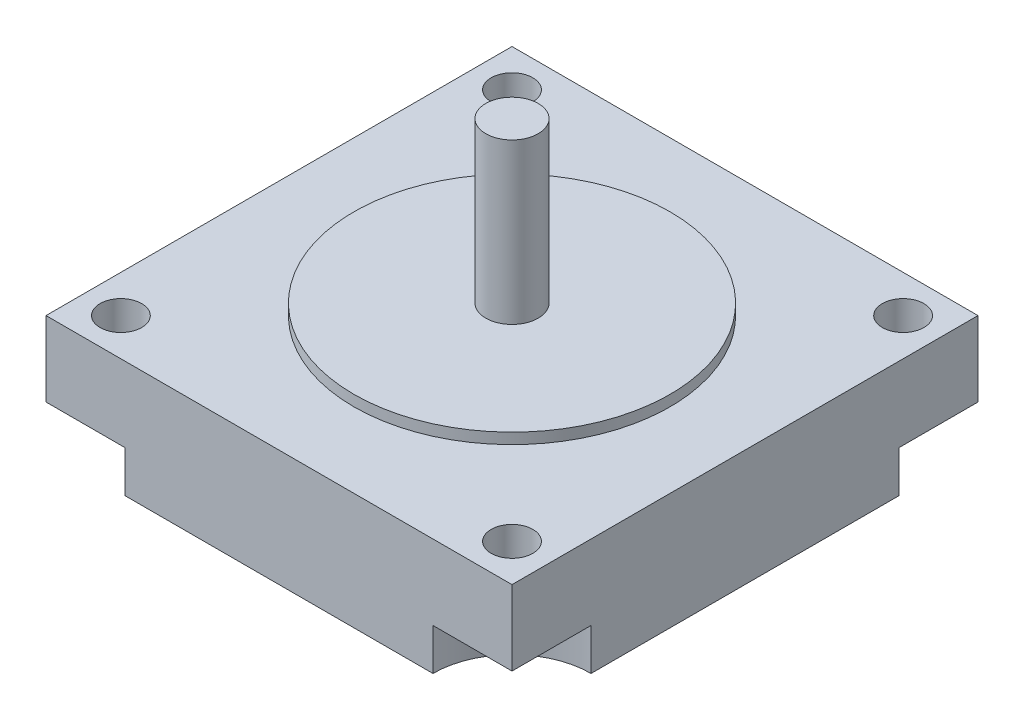
ISO-10303-21;
HEADER;
FILE_DESCRIPTION(('STEP AP214'),'2;1');
FILE_NAME('part.step','',(''),(''),'','','');
FILE_SCHEMA(('AUTOMOTIVE_DESIGN { 1 0 10303 214 1 1 1 1 }'));
ENDSEC;
DATA;
#1=APPLICATION_CONTEXT('core data for automotive mechanical design processes');
#2=APPLICATION_PROTOCOL_DEFINITION('international standard','automotive_design',2000,#1);
#3=PRODUCT_CONTEXT('',#1,'mechanical');
#4=PRODUCT('Part','Part','',(#3));
#5=PRODUCT_RELATED_PRODUCT_CATEGORY('part','',(#4));
#6=PRODUCT_DEFINITION_FORMATION('','',#4);
#7=PRODUCT_DEFINITION_CONTEXT('part definition',#1,'design');
#8=PRODUCT_DEFINITION('design','',#6,#7);
#9=PRODUCT_DEFINITION_SHAPE('','',#8);
#10=(LENGTH_UNIT() NAMED_UNIT(*) SI_UNIT(.MILLI.,.METRE.));
#11=(NAMED_UNIT(*) PLANE_ANGLE_UNIT() SI_UNIT($,.RADIAN.));
#12=(NAMED_UNIT(*) SI_UNIT($,.STERADIAN.) SOLID_ANGLE_UNIT());
#13=UNCERTAINTY_MEASURE_WITH_UNIT(LENGTH_MEASURE(1.E-05),#10,'distance_accuracy_value','');
#14=(GEOMETRIC_REPRESENTATION_CONTEXT(3) GLOBAL_UNCERTAINTY_ASSIGNED_CONTEXT((#13)) GLOBAL_UNIT_ASSIGNED_CONTEXT((#10,
#11,#12)) REPRESENTATION_CONTEXT('',''));
#15=CARTESIAN_POINT('',(0.,0.,0.));
#16=DIRECTION('',(0.,0.,1.));
#17=DIRECTION('',(1.,0.,0.));
#18=AXIS2_PLACEMENT_3D('',#15,#16,#17);
#19=CARTESIAN_POINT('',(-28.,5.,-28.));
#20=DIRECTION('',(0.,-1.,0.));
#21=DIRECTION('',(0.,0.,-1.));
#22=AXIS2_PLACEMENT_3D('',#19,#20,#21);
#23=CYLINDRICAL_SURFACE('',#22,9.5);
#24=CARTESIAN_POINT('',(-28.,0.,-28.));
#25=DIRECTION('',(0.,-1.,0.));
#26=DIRECTION('',(0.,0.,1.));
#27=AXIS2_PLACEMENT_3D('',#24,#25,#26);
#28=CIRCLE('',#27,9.5);
#29=CARTESIAN_POINT('',(-18.5,0.,-28.));
#30=VERTEX_POINT('',#29);
#31=CARTESIAN_POINT('',(-28.,0.,-18.5));
#32=VERTEX_POINT('',#31);
#33=EDGE_CURVE('E163',#30,#32,#28,.T.);
#34=ORIENTED_EDGE('',*,*,#33,.T.);
#35=DIRECTION('',(0.,-1.,0.));
#36=VECTOR('',#35,1.);
#37=CARTESIAN_POINT('',(-28.,5.,-18.5));
#38=LINE('',#37,#36);
#39=CARTESIAN_POINT('',(-28.,5.,-18.5));
#40=VERTEX_POINT('',#39);
#41=EDGE_CURVE('E11',#40,#32,#38,.T.);
#42=ORIENTED_EDGE('',*,*,#41,.F.);
#43=CARTESIAN_POINT('',(-28.,5.,-28.));
#44=DIRECTION('',(0.,-1.,0.));
#45=DIRECTION('',(0.,0.,1.));
#46=AXIS2_PLACEMENT_3D('',#43,#44,#45);
#47=CIRCLE('',#46,9.5);
#48=CARTESIAN_POINT('',(-18.5,5.,-28.));
#49=VERTEX_POINT('',#48);
#50=EDGE_CURVE('E164',#49,#40,#47,.T.);
#51=ORIENTED_EDGE('',*,*,#50,.F.);
#52=DIRECTION('',(0.,-1.,0.));
#53=VECTOR('',#52,1.);
#54=CARTESIAN_POINT('',(-18.5,5.,-28.));
#55=LINE('',#54,#53);
#56=EDGE_CURVE('E48',#49,#30,#55,.T.);
#57=ORIENTED_EDGE('',*,*,#56,.T.);
#58=EDGE_LOOP('',(#34,#42,#51,#57));
#59=FACE_BOUND('',#58,.T.);
#60=ADVANCED_FACE('F32',(#59),#23,.F.);
#61=CARTESIAN_POINT('',(-28.,5.,-18.5));
#62=DIRECTION('',(1.,0.,0.));
#63=DIRECTION('',(0.,0.,-1.));
#64=AXIS2_PLACEMENT_3D('',#61,#62,#63);
#65=PLANE('',#64);
#66=DIRECTION('',(0.,0.,1.));
#67=VECTOR('',#66,1.);
#68=CARTESIAN_POINT('',(-28.,0.,-18.5));
#69=LINE('',#68,#67);
#70=CARTESIAN_POINT('',(-28.,0.,18.5));
#71=VERTEX_POINT('',#70);
#72=EDGE_CURVE('E171',#32,#71,#69,.T.);
#73=ORIENTED_EDGE('',*,*,#72,.T.);
#74=DIRECTION('',(0.,-1.,0.));
#75=VECTOR('',#74,1.);
#76=CARTESIAN_POINT('',(-28.,5.,18.5));
#77=LINE('',#76,#75);
#78=CARTESIAN_POINT('',(-28.,5.,18.5));
#79=VERTEX_POINT('',#78);
#80=EDGE_CURVE('E40',#79,#71,#77,.T.);
#81=ORIENTED_EDGE('',*,*,#80,.F.);
#82=DIRECTION('',(0.,0.,1.));
#83=VECTOR('',#82,1.);
#84=CARTESIAN_POINT('',(-28.,5.,-28.));
#85=LINE('',#84,#83);
#86=CARTESIAN_POINT('',(-28.,5.,28.));
#87=VERTEX_POINT('',#86);
#88=EDGE_CURVE('E145',#79,#87,#85,.T.);
#89=ORIENTED_EDGE('',*,*,#88,.T.);
#90=DIRECTION('',(0.,-1.,0.));
#91=VECTOR('',#90,1.);
#92=CARTESIAN_POINT('',(-28.,14.,28.));
#93=LINE('',#92,#91);
#94=CARTESIAN_POINT('',(-28.,14.,28.));
#95=VERTEX_POINT('',#94);
#96=EDGE_CURVE('E154',#95,#87,#93,.T.);
#97=ORIENTED_EDGE('',*,*,#96,.F.);
#98=DIRECTION('',(0.,0.,1.));
#99=VECTOR('',#98,1.);
#100=CARTESIAN_POINT('',(-28.,14.,-28.));
#101=LINE('',#100,#99);
#102=CARTESIAN_POINT('',(-28.,14.,-28.));
#103=VERTEX_POINT('',#102);
#104=EDGE_CURVE('E221',#103,#95,#101,.T.);
#105=ORIENTED_EDGE('',*,*,#104,.F.);
#106=DIRECTION('',(0.,-1.,0.));
#107=VECTOR('',#106,1.);
#108=CARTESIAN_POINT('',(-28.,14.,-28.));
#109=LINE('',#108,#107);
#110=CARTESIAN_POINT('',(-28.,5.,-28.));
#111=VERTEX_POINT('',#110);
#112=EDGE_CURVE('E157',#103,#111,#109,.T.);
#113=ORIENTED_EDGE('',*,*,#112,.T.);
#114=EDGE_CURVE('E146',#111,#40,#85,.T.);
#115=ORIENTED_EDGE('',*,*,#114,.T.);
#116=ORIENTED_EDGE('',*,*,#41,.T.);
#117=EDGE_LOOP('',(#73,#81,#89,#97,#105,#113,#115,#116));
#118=FACE_BOUND('',#117,.T.);
#119=ADVANCED_FACE('F208',(#118),#65,.F.);
#120=CARTESIAN_POINT('',(-28.,5.,28.));
#121=DIRECTION('',(0.,-1.,0.));
#122=DIRECTION('',(0.,0.,-1.));
#123=AXIS2_PLACEMENT_3D('',#120,#121,#122);
#124=CYLINDRICAL_SURFACE('',#123,9.5);
#125=CARTESIAN_POINT('',(-28.,0.,28.));
#126=DIRECTION('',(0.,-1.,0.));
#127=DIRECTION('',(0.,0.,1.));
#128=AXIS2_PLACEMENT_3D('',#125,#126,#127);
#129=CIRCLE('',#128,9.5);
#130=CARTESIAN_POINT('',(-18.5,0.,28.));
#131=VERTEX_POINT('',#130);
#132=EDGE_CURVE('E173',#71,#131,#129,.T.);
#133=ORIENTED_EDGE('',*,*,#132,.T.);
#134=DIRECTION('',(0.,-1.,0.));
#135=VECTOR('',#134,1.);
#136=CARTESIAN_POINT('',(-18.5,5.,28.));
#137=LINE('',#136,#135);
#138=CARTESIAN_POINT('',(-18.5,5.,28.));
#139=VERTEX_POINT('',#138);
#140=EDGE_CURVE('E187',#139,#131,#137,.T.);
#141=ORIENTED_EDGE('',*,*,#140,.F.);
#142=CARTESIAN_POINT('',(-28.,5.,28.));
#143=DIRECTION('',(0.,-1.,0.));
#144=DIRECTION('',(0.,0.,1.));
#145=AXIS2_PLACEMENT_3D('',#142,#143,#144);
#146=CIRCLE('',#145,9.5);
#147=EDGE_CURVE('E126',#79,#139,#146,.T.);
#148=ORIENTED_EDGE('',*,*,#147,.F.);
#149=ORIENTED_EDGE('',*,*,#80,.T.);
#150=EDGE_LOOP('',(#133,#141,#148,#149));
#151=FACE_BOUND('',#150,.T.);
#152=ADVANCED_FACE('F193',(#151),#124,.F.);
#153=CARTESIAN_POINT('',(-18.5,5.,28.));
#154=DIRECTION('',(0.,0.,-1.));
#155=DIRECTION('',(-1.,0.,0.));
#156=AXIS2_PLACEMENT_3D('',#153,#154,#155);
#157=PLANE('',#156);
#158=DIRECTION('',(1.,0.,0.));
#159=VECTOR('',#158,1.);
#160=CARTESIAN_POINT('',(-18.5,0.,28.));
#161=LINE('',#160,#159);
#162=CARTESIAN_POINT('',(18.5,0.,28.));
#163=VERTEX_POINT('',#162);
#164=EDGE_CURVE('E175',#131,#163,#161,.T.);
#165=ORIENTED_EDGE('',*,*,#164,.T.);
#166=DIRECTION('',(0.,-1.,0.));
#167=VECTOR('',#166,1.);
#168=CARTESIAN_POINT('',(18.5,5.,28.));
#169=LINE('',#168,#167);
#170=CARTESIAN_POINT('',(18.5,5.,28.));
#171=VERTEX_POINT('',#170);
#172=EDGE_CURVE('E115',#171,#163,#169,.T.);
#173=ORIENTED_EDGE('',*,*,#172,.F.);
#174=DIRECTION('',(1.,0.,0.));
#175=VECTOR('',#174,1.);
#176=CARTESIAN_POINT('',(-28.,5.,28.));
#177=LINE('',#176,#175);
#178=CARTESIAN_POINT('',(28.,5.,28.));
#179=VERTEX_POINT('',#178);
#180=EDGE_CURVE('E124',#171,#179,#177,.T.);
#181=ORIENTED_EDGE('',*,*,#180,.T.);
#182=DIRECTION('',(0.,-1.,0.));
#183=VECTOR('',#182,1.);
#184=CARTESIAN_POINT('',(28.,14.,28.));
#185=LINE('',#184,#183);
#186=CARTESIAN_POINT('',(28.,14.,28.));
#187=VERTEX_POINT('',#186);
#188=EDGE_CURVE('E132',#187,#179,#185,.T.);
#189=ORIENTED_EDGE('',*,*,#188,.F.);
#190=DIRECTION('',(1.,0.,0.));
#191=VECTOR('',#190,1.);
#192=CARTESIAN_POINT('',(-28.,14.,28.));
#193=LINE('',#192,#191);
#194=EDGE_CURVE('E141',#95,#187,#193,.T.);
#195=ORIENTED_EDGE('',*,*,#194,.F.);
#196=ORIENTED_EDGE('',*,*,#96,.T.);
#197=EDGE_CURVE('E149',#87,#139,#177,.T.);
#198=ORIENTED_EDGE('',*,*,#197,.T.);
#199=ORIENTED_EDGE('',*,*,#140,.T.);
#200=EDGE_LOOP('',(#165,#173,#181,#189,#195,#196,#198,#199));
#201=FACE_BOUND('',#200,.T.);
#202=ADVANCED_FACE('F202',(#201),#157,.F.);
#203=CARTESIAN_POINT('',(28.,5.,28.));
#204=DIRECTION('',(0.,-1.,0.));
#205=DIRECTION('',(0.,0.,-1.));
#206=AXIS2_PLACEMENT_3D('',#203,#204,#205);
#207=CYLINDRICAL_SURFACE('',#206,9.5);
#208=CARTESIAN_POINT('',(28.,0.,28.));
#209=DIRECTION('',(0.,-1.,0.));
#210=DIRECTION('',(0.,0.,1.));
#211=AXIS2_PLACEMENT_3D('',#208,#209,#210);
#212=CIRCLE('',#211,9.5);
#213=CARTESIAN_POINT('',(28.,0.,18.5));
#214=VERTEX_POINT('',#213);
#215=EDGE_CURVE('E111',#163,#214,#212,.T.);
#216=ORIENTED_EDGE('',*,*,#215,.T.);
#217=DIRECTION('',(0.,-1.,0.));
#218=VECTOR('',#217,1.);
#219=CARTESIAN_POINT('',(28.,5.,18.5));
#220=LINE('',#219,#218);
#221=CARTESIAN_POINT('',(28.,5.,18.5));
#222=VERTEX_POINT('',#221);
#223=EDGE_CURVE('E104',#222,#214,#220,.T.);
#224=ORIENTED_EDGE('',*,*,#223,.F.);
#225=CARTESIAN_POINT('',(28.,5.,28.));
#226=DIRECTION('',(0.,-1.,0.));
#227=DIRECTION('',(0.,0.,1.));
#228=AXIS2_PLACEMENT_3D('',#225,#226,#227);
#229=CIRCLE('',#228,9.5);
#230=EDGE_CURVE('E108',#171,#222,#229,.T.);
#231=ORIENTED_EDGE('',*,*,#230,.F.);
#232=ORIENTED_EDGE('',*,*,#172,.T.);
#233=EDGE_LOOP('',(#216,#224,#231,#232));
#234=FACE_BOUND('',#233,.T.);
#235=ADVANCED_FACE('F106',(#234),#207,.F.);
#236=CARTESIAN_POINT('',(28.,5.,-18.5));
#237=DIRECTION('',(-1.,0.,0.));
#238=DIRECTION('',(0.,0.,1.));
#239=AXIS2_PLACEMENT_3D('',#236,#237,#238);
#240=PLANE('',#239);
#241=DIRECTION('',(0.,0.,-1.));
#242=VECTOR('',#241,1.);
#243=CARTESIAN_POINT('',(28.,0.,-18.5));
#244=LINE('',#243,#242);
#245=CARTESIAN_POINT('',(28.,0.,-18.5));
#246=VERTEX_POINT('',#245);
#247=EDGE_CURVE('E178',#214,#246,#244,.T.);
#248=ORIENTED_EDGE('',*,*,#247,.T.);
#249=DIRECTION('',(0.,-1.,0.));
#250=VECTOR('',#249,1.);
#251=CARTESIAN_POINT('',(28.,5.,-18.5));
#252=LINE('',#251,#250);
#253=CARTESIAN_POINT('',(28.,5.,-18.5));
#254=VERTEX_POINT('',#253);
#255=EDGE_CURVE('E116',#254,#246,#252,.T.);
#256=ORIENTED_EDGE('',*,*,#255,.F.);
#257=DIRECTION('',(0.,0.,-1.));
#258=VECTOR('',#257,1.);
#259=CARTESIAN_POINT('',(28.,5.,-28.));
#260=LINE('',#259,#258);
#261=CARTESIAN_POINT('',(28.,5.,-28.));
#262=VERTEX_POINT('',#261);
#263=EDGE_CURVE('E134',#254,#262,#260,.T.);
#264=ORIENTED_EDGE('',*,*,#263,.T.);
#265=DIRECTION('',(0.,-1.,0.));
#266=VECTOR('',#265,1.);
#267=CARTESIAN_POINT('',(28.,14.,-28.));
#268=LINE('',#267,#266);
#269=CARTESIAN_POINT('',(28.,14.,-28.));
#270=VERTEX_POINT('',#269);
#271=EDGE_CURVE('E160',#270,#262,#268,.T.);
#272=ORIENTED_EDGE('',*,*,#271,.F.);
#273=DIRECTION('',(0.,0.,-1.));
#274=VECTOR('',#273,1.);
#275=CARTESIAN_POINT('',(28.,14.,-28.));
#276=LINE('',#275,#274);
#277=EDGE_CURVE('E152',#187,#270,#276,.T.);
#278=ORIENTED_EDGE('',*,*,#277,.F.);
#279=ORIENTED_EDGE('',*,*,#188,.T.);
#280=EDGE_CURVE('E122',#179,#222,#260,.T.);
#281=ORIENTED_EDGE('',*,*,#280,.T.);
#282=ORIENTED_EDGE('',*,*,#223,.T.);
#283=EDGE_LOOP('',(#248,#256,#264,#272,#278,#279,#281,#282));
#284=FACE_BOUND('',#283,.T.);
#285=ADVANCED_FACE('F129',(#284),#240,.F.);
#286=CARTESIAN_POINT('',(28.,5.,-28.));
#287=DIRECTION('',(0.,-1.,0.));
#288=DIRECTION('',(0.,0.,-1.));
#289=AXIS2_PLACEMENT_3D('',#286,#287,#288);
#290=CYLINDRICAL_SURFACE('',#289,9.5);
#291=CARTESIAN_POINT('',(28.,0.,-28.));
#292=DIRECTION('',(0.,-1.,0.));
#293=DIRECTION('',(0.,0.,1.));
#294=AXIS2_PLACEMENT_3D('',#291,#292,#293);
#295=CIRCLE('',#294,9.5);
#296=CARTESIAN_POINT('',(18.5,0.,-28.));
#297=VERTEX_POINT('',#296);
#298=EDGE_CURVE('E79',#246,#297,#295,.T.);
#299=ORIENTED_EDGE('',*,*,#298,.T.);
#300=DIRECTION('',(0.,-1.,0.));
#301=VECTOR('',#300,1.);
#302=CARTESIAN_POINT('',(18.5,5.,-28.));
#303=LINE('',#302,#301);
#304=CARTESIAN_POINT('',(18.5,5.,-28.));
#305=VERTEX_POINT('',#304);
#306=EDGE_CURVE('E183',#305,#297,#303,.T.);
#307=ORIENTED_EDGE('',*,*,#306,.F.);
#308=CARTESIAN_POINT('',(28.,5.,-28.));
#309=DIRECTION('',(0.,-1.,0.));
#310=DIRECTION('',(0.,0.,1.));
#311=AXIS2_PLACEMENT_3D('',#308,#309,#310);
#312=CIRCLE('',#311,9.5);
#313=EDGE_CURVE('E125',#254,#305,#312,.T.);
#314=ORIENTED_EDGE('',*,*,#313,.F.);
#315=ORIENTED_EDGE('',*,*,#255,.T.);
#316=EDGE_LOOP('',(#299,#307,#314,#315));
#317=FACE_BOUND('',#316,.T.);
#318=ADVANCED_FACE('F304',(#317),#290,.F.);
#319=CARTESIAN_POINT('',(-18.5,5.,-28.));
#320=DIRECTION('',(0.,0.,1.));
#321=DIRECTION('',(1.,0.,0.));
#322=AXIS2_PLACEMENT_3D('',#319,#320,#321);
#323=PLANE('',#322);
#324=DIRECTION('',(-1.,0.,0.));
#325=VECTOR('',#324,1.);
#326=CARTESIAN_POINT('',(-18.5,0.,-28.));
#327=LINE('',#326,#325);
#328=EDGE_CURVE('E83',#297,#30,#327,.T.);
#329=ORIENTED_EDGE('',*,*,#328,.T.);
#330=ORIENTED_EDGE('',*,*,#56,.F.);
#331=DIRECTION('',(-1.,0.,0.));
#332=VECTOR('',#331,1.);
#333=CARTESIAN_POINT('',(-28.,5.,-28.));
#334=LINE('',#333,#332);
#335=EDGE_CURVE('E133',#49,#111,#334,.T.);
#336=ORIENTED_EDGE('',*,*,#335,.T.);
#337=ORIENTED_EDGE('',*,*,#112,.F.);
#338=DIRECTION('',(-1.,0.,0.));
#339=VECTOR('',#338,1.);
#340=CARTESIAN_POINT('',(-28.,14.,-28.));
#341=LINE('',#340,#339);
#342=EDGE_CURVE('E222',#270,#103,#341,.T.);
#343=ORIENTED_EDGE('',*,*,#342,.F.);
#344=ORIENTED_EDGE('',*,*,#271,.T.);
#345=EDGE_CURVE('E136',#262,#305,#334,.T.);
#346=ORIENTED_EDGE('',*,*,#345,.T.);
#347=ORIENTED_EDGE('',*,*,#306,.T.);
#348=EDGE_LOOP('',(#329,#330,#336,#337,#343,#344,#346,#347));
#349=FACE_BOUND('',#348,.T.);
#350=ADVANCED_FACE('F298',(#349),#323,.F.);
#351=CARTESIAN_POINT('',(-28.,0.,-28.));
#352=DIRECTION('',(0.,1.,0.));
#353=DIRECTION('',(0.,0.,1.));
#354=AXIS2_PLACEMENT_3D('',#351,#352,#353);
#355=PLANE('',#354);
#356=ORIENTED_EDGE('',*,*,#33,.F.);
#357=ORIENTED_EDGE('',*,*,#328,.F.);
#358=ORIENTED_EDGE('',*,*,#298,.F.);
#359=ORIENTED_EDGE('',*,*,#247,.F.);
#360=ORIENTED_EDGE('',*,*,#215,.F.);
#361=ORIENTED_EDGE('',*,*,#164,.F.);
#362=ORIENTED_EDGE('',*,*,#132,.F.);
#363=ORIENTED_EDGE('',*,*,#72,.F.);
#364=EDGE_LOOP('',(#356,#357,#358,#359,#360,#361,#362,#363));
#365=FACE_BOUND('',#364,.T.);
#366=ADVANCED_FACE('F200',(#365),#355,.F.);
#367=CARTESIAN_POINT('',(0.,5.,0.));
#368=DIRECTION('',(0.,1.,0.));
#369=DIRECTION('',(0.,0.,1.));
#370=AXIS2_PLACEMENT_3D('',#367,#368,#369);
#371=PLANE('',#370);
#372=CARTESIAN_POINT('',(-23.5,5.,-23.5));
#373=DIRECTION('',(0.,1.,0.));
#374=DIRECTION('',(0.,0.,1.));
#375=AXIS2_PLACEMENT_3D('',#372,#373,#374);
#376=CIRCLE('',#375,2.5);
#377=CARTESIAN_POINT('',(-23.5,5.,-21.));
#378=VERTEX_POINT('',#377);
#379=EDGE_CURVE('E230',#378,#378,#376,.T.);
#380=ORIENTED_EDGE('',*,*,#379,.T.);
#381=EDGE_LOOP('',(#380));
#382=FACE_BOUND('',#381,.T.);
#383=ORIENTED_EDGE('',*,*,#335,.F.);
#384=ORIENTED_EDGE('',*,*,#50,.T.);
#385=ORIENTED_EDGE('',*,*,#114,.F.);
#386=EDGE_LOOP('',(#383,#384,#385));
#387=FACE_BOUND('',#386,.T.);
#388=ADVANCED_FACE('F309',(#382,#387),#371,.F.);
#389=CARTESIAN_POINT('',(-23.5,5.,23.5));
#390=DIRECTION('',(0.,1.,0.));
#391=DIRECTION('',(0.,0.,1.));
#392=AXIS2_PLACEMENT_3D('',#389,#390,#391);
#393=CIRCLE('',#392,2.5);
#394=CARTESIAN_POINT('',(-23.5,5.,26.));
#395=VERTEX_POINT('',#394);
#396=EDGE_CURVE('E244',#395,#395,#393,.T.);
#397=ORIENTED_EDGE('',*,*,#396,.T.);
#398=EDGE_LOOP('',(#397));
#399=FACE_BOUND('',#398,.T.);
#400=ORIENTED_EDGE('',*,*,#88,.F.);
#401=ORIENTED_EDGE('',*,*,#147,.T.);
#402=ORIENTED_EDGE('',*,*,#197,.F.);
#403=EDGE_LOOP('',(#400,#401,#402));
#404=FACE_BOUND('',#403,.T.);
#405=ADVANCED_FACE('F205',(#399,#404),#371,.F.);
#406=CARTESIAN_POINT('',(23.5,5.,23.5));
#407=DIRECTION('',(0.,1.,0.));
#408=DIRECTION('',(0.,0.,1.));
#409=AXIS2_PLACEMENT_3D('',#406,#407,#408);
#410=CIRCLE('',#409,2.5);
#411=CARTESIAN_POINT('',(23.5,5.,26.));
#412=VERTEX_POINT('',#411);
#413=EDGE_CURVE('E241',#412,#412,#410,.T.);
#414=ORIENTED_EDGE('',*,*,#413,.T.);
#415=EDGE_LOOP('',(#414));
#416=FACE_BOUND('',#415,.T.);
#417=ORIENTED_EDGE('',*,*,#180,.F.);
#418=ORIENTED_EDGE('',*,*,#230,.T.);
#419=ORIENTED_EDGE('',*,*,#280,.F.);
#420=EDGE_LOOP('',(#417,#418,#419));
#421=FACE_BOUND('',#420,.T.);
#422=ADVANCED_FACE('F120',(#416,#421),#371,.F.);
#423=CARTESIAN_POINT('',(23.5,5.,-23.5));
#424=DIRECTION('',(0.,1.,0.));
#425=DIRECTION('',(0.,0.,1.));
#426=AXIS2_PLACEMENT_3D('',#423,#424,#425);
#427=CIRCLE('',#426,2.5);
#428=CARTESIAN_POINT('',(23.5,5.,-21.));
#429=VERTEX_POINT('',#428);
#430=EDGE_CURVE('E238',#429,#429,#427,.T.);
#431=ORIENTED_EDGE('',*,*,#430,.T.);
#432=EDGE_LOOP('',(#431));
#433=FACE_BOUND('',#432,.T.);
#434=ORIENTED_EDGE('',*,*,#263,.F.);
#435=ORIENTED_EDGE('',*,*,#313,.T.);
#436=ORIENTED_EDGE('',*,*,#345,.F.);
#437=EDGE_LOOP('',(#434,#435,#436));
#438=FACE_BOUND('',#437,.T.);
#439=ADVANCED_FACE('F287',(#433,#438),#371,.F.);
#440=CARTESIAN_POINT('',(0.,14.,0.));
#441=DIRECTION('',(0.,1.,0.));
#442=DIRECTION('',(0.,0.,1.));
#443=AXIS2_PLACEMENT_3D('',#440,#441,#442);
#444=PLANE('',#443);
#445=CARTESIAN_POINT('',(23.5,14.,-23.5));
#446=DIRECTION('',(0.,1.,0.));
#447=DIRECTION('',(0.,0.,1.));
#448=AXIS2_PLACEMENT_3D('',#445,#446,#447);
#449=CIRCLE('',#448,2.5);
#450=CARTESIAN_POINT('',(23.5,14.,-21.));
#451=VERTEX_POINT('',#450);
#452=EDGE_CURVE('E247',#451,#451,#449,.T.);
#453=ORIENTED_EDGE('',*,*,#452,.F.);
#454=EDGE_LOOP('',(#453));
#455=FACE_BOUND('',#454,.T.);
#456=CARTESIAN_POINT('',(23.5,14.,23.5));
#457=DIRECTION('',(0.,1.,0.));
#458=DIRECTION('',(0.,0.,1.));
#459=AXIS2_PLACEMENT_3D('',#456,#457,#458);
#460=CIRCLE('',#459,2.5);
#461=CARTESIAN_POINT('',(23.5,14.,26.));
#462=VERTEX_POINT('',#461);
#463=EDGE_CURVE('E251',#462,#462,#460,.T.);
#464=ORIENTED_EDGE('',*,*,#463,.F.);
#465=EDGE_LOOP('',(#464));
#466=FACE_BOUND('',#465,.T.);
#467=CARTESIAN_POINT('',(-23.5,14.,23.5));
#468=DIRECTION('',(0.,1.,0.));
#469=DIRECTION('',(0.,0.,1.));
#470=AXIS2_PLACEMENT_3D('',#467,#468,#469);
#471=CIRCLE('',#470,2.5);
#472=CARTESIAN_POINT('',(-23.5,14.,26.));
#473=VERTEX_POINT('',#472);
#474=EDGE_CURVE('E248',#473,#473,#471,.T.);
#475=ORIENTED_EDGE('',*,*,#474,.F.);
#476=EDGE_LOOP('',(#475));
#477=FACE_BOUND('',#476,.T.);
#478=CARTESIAN_POINT('',(-23.5,14.,-23.5));
#479=DIRECTION('',(0.,1.,0.));
#480=DIRECTION('',(0.,0.,1.));
#481=AXIS2_PLACEMENT_3D('',#478,#479,#480);
#482=CIRCLE('',#481,2.5);
#483=CARTESIAN_POINT('',(-23.5,14.,-21.));
#484=VERTEX_POINT('',#483);
#485=EDGE_CURVE('E235',#484,#484,#482,.T.);
#486=ORIENTED_EDGE('',*,*,#485,.F.);
#487=EDGE_LOOP('',(#486));
#488=FACE_BOUND('',#487,.T.);
#489=CARTESIAN_POINT('',(0.,14.,0.));
#490=DIRECTION('',(0.,1.,0.));
#491=DIRECTION('',(0.,0.,1.));
#492=AXIS2_PLACEMENT_3D('',#489,#490,#491);
#493=CIRCLE('',#492,19.);
#494=CARTESIAN_POINT('',(0.,14.,19.));
#495=VERTEX_POINT('',#494);
#496=EDGE_CURVE('E227',#495,#495,#493,.T.);
#497=ORIENTED_EDGE('',*,*,#496,.F.);
#498=EDGE_LOOP('',(#497));
#499=FACE_BOUND('',#498,.T.);
#500=ORIENTED_EDGE('',*,*,#277,.T.);
#501=ORIENTED_EDGE('',*,*,#342,.T.);
#502=ORIENTED_EDGE('',*,*,#104,.T.);
#503=ORIENTED_EDGE('',*,*,#194,.T.);
#504=EDGE_LOOP('',(#500,#501,#502,#503));
#505=FACE_BOUND('',#504,.T.);
#506=ADVANCED_FACE('F282',(#455,#466,#477,#488,#499,#505),#444,.T.);
#507=CARTESIAN_POINT('',(0.,15.3,0.));
#508=DIRECTION('',(0.,-1.,0.));
#509=DIRECTION('',(0.,0.,-1.));
#510=AXIS2_PLACEMENT_3D('',#507,#508,#509);
#511=CYLINDRICAL_SURFACE('',#510,19.);
#512=CARTESIAN_POINT('',(0.,15.3,0.));
#513=DIRECTION('',(0.,1.,0.));
#514=DIRECTION('',(0.,0.,1.));
#515=AXIS2_PLACEMENT_3D('',#512,#513,#514);
#516=CIRCLE('',#515,19.);
#517=CARTESIAN_POINT('',(0.,15.3,19.));
#518=VERTEX_POINT('',#517);
#519=EDGE_CURVE('E139',#518,#518,#516,.T.);
#520=ORIENTED_EDGE('',*,*,#519,.F.);
#521=EDGE_LOOP('',(#520));
#522=FACE_BOUND('',#521,.T.);
#523=ORIENTED_EDGE('',*,*,#496,.T.);
#524=EDGE_LOOP('',(#523));
#525=FACE_BOUND('',#524,.T.);
#526=ADVANCED_FACE('F276',(#522,#525),#511,.T.);
#527=CARTESIAN_POINT('',(0.,15.3,0.));
#528=DIRECTION('',(0.,1.,0.));
#529=DIRECTION('',(0.,0.,1.));
#530=AXIS2_PLACEMENT_3D('',#527,#528,#529);
#531=PLANE('',#530);
#532=CARTESIAN_POINT('',(0.,15.3,0.));
#533=DIRECTION('',(0.,1.,0.));
#534=DIRECTION('',(0.,0.,1.));
#535=AXIS2_PLACEMENT_3D('',#532,#533,#534);
#536=CIRCLE('',#535,3.15);
#537=CARTESIAN_POINT('',(0.,15.3,3.15));
#538=VERTEX_POINT('',#537);
#539=EDGE_CURVE('E257',#538,#538,#536,.T.);
#540=ORIENTED_EDGE('',*,*,#539,.F.);
#541=EDGE_LOOP('',(#540));
#542=FACE_BOUND('',#541,.T.);
#543=ORIENTED_EDGE('',*,*,#519,.T.);
#544=EDGE_LOOP('',(#543));
#545=FACE_BOUND('',#544,.T.);
#546=ADVANCED_FACE('F272',(#542,#545),#531,.T.);
#547=CARTESIAN_POINT('',(-23.5,0.,-23.5));
#548=DIRECTION('',(0.,1.,0.));
#549=DIRECTION('',(0.,0.,1.));
#550=AXIS2_PLACEMENT_3D('',#547,#548,#549);
#551=CYLINDRICAL_SURFACE('',#550,2.5);
#552=CARTESIAN_POINT('',(-23.5,14.,-21.));
#553=CARTESIAN_POINT('',(-23.5,13.90625,-21.));
#554=CARTESIAN_POINT('',(-23.5,13.8125,-21.));
#555=CARTESIAN_POINT('',(-23.5,13.625,-21.));
#556=CARTESIAN_POINT('',(-23.5,13.53125,-21.));
#557=CARTESIAN_POINT('',(-23.5,13.34375,-21.));
#558=CARTESIAN_POINT('',(-23.5,13.25,-21.));
#559=CARTESIAN_POINT('',(-23.5,13.0625,-21.));
#560=CARTESIAN_POINT('',(-23.5,12.96875,-21.));
#561=CARTESIAN_POINT('',(-23.5,12.78125,-21.));
#562=CARTESIAN_POINT('',(-23.5,12.6875,-21.));
#563=CARTESIAN_POINT('',(-23.5,12.5,-21.));
#564=CARTESIAN_POINT('',(-23.5,12.40625,-21.));
#565=CARTESIAN_POINT('',(-23.5,12.21875,-21.));
#566=CARTESIAN_POINT('',(-23.5,12.125,-21.));
#567=CARTESIAN_POINT('',(-23.5,11.9375,-21.));
#568=CARTESIAN_POINT('',(-23.5,11.84375,-21.));
#569=CARTESIAN_POINT('',(-23.5,11.65625,-21.));
#570=CARTESIAN_POINT('',(-23.5,11.5625,-21.));
#571=CARTESIAN_POINT('',(-23.5,11.375,-21.));
#572=CARTESIAN_POINT('',(-23.5,11.28125,-21.));
#573=CARTESIAN_POINT('',(-23.5,11.09375,-21.));
#574=CARTESIAN_POINT('',(-23.5,11.,-21.));
#575=CARTESIAN_POINT('',(-23.5,10.8125,-21.));
#576=CARTESIAN_POINT('',(-23.5,10.71875,-21.));
#577=CARTESIAN_POINT('',(-23.5,10.53125,-21.));
#578=CARTESIAN_POINT('',(-23.5,10.4375,-21.));
#579=CARTESIAN_POINT('',(-23.5,10.25,-21.));
#580=CARTESIAN_POINT('',(-23.5,10.15625,-21.));
#581=CARTESIAN_POINT('',(-23.5,9.96875,-21.));
#582=CARTESIAN_POINT('',(-23.5,9.875,-21.));
#583=CARTESIAN_POINT('',(-23.5,9.6875,-21.));
#584=CARTESIAN_POINT('',(-23.5,9.59375,-21.));
#585=CARTESIAN_POINT('',(-23.5,9.40625,-21.));
#586=CARTESIAN_POINT('',(-23.5,9.3125,-21.));
#587=CARTESIAN_POINT('',(-23.5,9.125,-21.));
#588=CARTESIAN_POINT('',(-23.5,9.03125,-21.));
#589=CARTESIAN_POINT('',(-23.5,8.84375,-21.));
#590=CARTESIAN_POINT('',(-23.5,8.75,-21.));
#591=CARTESIAN_POINT('',(-23.5,8.5625,-21.));
#592=CARTESIAN_POINT('',(-23.5,8.46875,-21.));
#593=CARTESIAN_POINT('',(-23.5,8.28125,-21.));
#594=CARTESIAN_POINT('',(-23.5,8.1875,-21.));
#595=CARTESIAN_POINT('',(-23.5,8.,-21.));
#596=CARTESIAN_POINT('',(-23.5,7.90625,-21.));
#597=CARTESIAN_POINT('',(-23.5,7.71875,-21.));
#598=CARTESIAN_POINT('',(-23.5,7.625,-21.));
#599=CARTESIAN_POINT('',(-23.5,7.4375,-21.));
#600=CARTESIAN_POINT('',(-23.5,7.34375,-21.));
#601=CARTESIAN_POINT('',(-23.5,7.15625,-21.));
#602=CARTESIAN_POINT('',(-23.5,7.0625,-21.));
#603=CARTESIAN_POINT('',(-23.5,6.875,-21.));
#604=CARTESIAN_POINT('',(-23.5,6.78125,-21.));
#605=CARTESIAN_POINT('',(-23.5,6.59375,-21.));
#606=CARTESIAN_POINT('',(-23.5,6.5,-21.));
#607=CARTESIAN_POINT('',(-23.5,6.3125,-21.));
#608=CARTESIAN_POINT('',(-23.5,6.21875,-21.));
#609=CARTESIAN_POINT('',(-23.5,6.03125,-21.));
#610=CARTESIAN_POINT('',(-23.5,5.9375,-21.));
#611=CARTESIAN_POINT('',(-23.5,5.75,-21.));
#612=CARTESIAN_POINT('',(-23.5,5.65625,-21.));
#613=CARTESIAN_POINT('',(-23.5,5.46875,-21.));
#614=CARTESIAN_POINT('',(-23.5,5.375,-21.));
#615=CARTESIAN_POINT('',(-23.5,5.1875,-21.));
#616=CARTESIAN_POINT('',(-23.5,5.09375,-21.));
#617=CARTESIAN_POINT('',(-23.5,5.,-21.));
#618=B_SPLINE_CURVE_WITH_KNOTS('',3,(#552,#553,#554,#555,#556,#557,#558,#559,#560,#561,#562,
#563,#564,#565,#566,#567,#568,#569,#570,#571,#572,#573,#574,#575,#576,#577,#578,#579,#580,#581,
#582,#583,#584,#585,#586,#587,#588,#589,#590,#591,#592,#593,#594,#595,#596,#597,#598,#599,#600,
#601,#602,#603,#604,#605,#606,#607,#608,#609,#610,#611,#612,#613,#614,#615,#616,#617),
.UNSPECIFIED.,.F.,.F.,(4,2,2,2,2,2,2,2,2,2,2,2,2,2,2,2,2,2,2,2,2,2,2,2,2,2,2,2,2,2,2,2,4),(0.,
0.28125,0.5625,0.843749999999999,1.125,1.40625,1.6875,1.96875,2.25,2.53125,2.8125,3.09375,3.375,
3.65625,3.9375,4.21875,4.5,4.78125,5.0625,5.34375,5.625,5.90625,6.1875,6.46875,6.75,7.03125,
7.3125,7.59375,7.875,8.15625,8.43749999999999,8.71875,9.),.UNSPECIFIED.);
#619=EDGE_CURVE('BSEAM275',#484,#378,#618,.T.);
#620=ORIENTED_EDGE('',*,*,#485,.T.);
#621=ORIENTED_EDGE('',*,*,#379,.F.);
#622=ORIENTED_EDGE('',*,*,#619,.T.);
#623=ORIENTED_EDGE('',*,*,#619,.F.);
#624=EDGE_LOOP('',(#620,#622,#621,#623));
#625=FACE_BOUND('',#624,.T.);
#626=ADVANCED_FACE('F275',(#625),#551,.F.);
#627=CARTESIAN_POINT('',(-23.5,0.,23.5));
#628=DIRECTION('',(0.,1.,0.));
#629=DIRECTION('',(0.,0.,1.));
#630=AXIS2_PLACEMENT_3D('',#627,#628,#629);
#631=CYLINDRICAL_SURFACE('',#630,2.5);
#632=CARTESIAN_POINT('',(-23.5,14.,26.));
#633=CARTESIAN_POINT('',(-23.5,13.90625,26.));
#634=CARTESIAN_POINT('',(-23.5,13.8125,26.));
#635=CARTESIAN_POINT('',(-23.5,13.625,26.));
#636=CARTESIAN_POINT('',(-23.5,13.53125,26.));
#637=CARTESIAN_POINT('',(-23.5,13.34375,26.));
#638=CARTESIAN_POINT('',(-23.5,13.25,26.));
#639=CARTESIAN_POINT('',(-23.5,13.0625,26.));
#640=CARTESIAN_POINT('',(-23.5,12.96875,26.));
#641=CARTESIAN_POINT('',(-23.5,12.78125,26.));
#642=CARTESIAN_POINT('',(-23.5,12.6875,26.));
#643=CARTESIAN_POINT('',(-23.5,12.5,26.));
#644=CARTESIAN_POINT('',(-23.5,12.40625,26.));
#645=CARTESIAN_POINT('',(-23.5,12.21875,26.));
#646=CARTESIAN_POINT('',(-23.5,12.125,26.));
#647=CARTESIAN_POINT('',(-23.5,11.9375,26.));
#648=CARTESIAN_POINT('',(-23.5,11.84375,26.));
#649=CARTESIAN_POINT('',(-23.5,11.65625,26.));
#650=CARTESIAN_POINT('',(-23.5,11.5625,26.));
#651=CARTESIAN_POINT('',(-23.5,11.375,26.));
#652=CARTESIAN_POINT('',(-23.5,11.28125,26.));
#653=CARTESIAN_POINT('',(-23.5,11.09375,26.));
#654=CARTESIAN_POINT('',(-23.5,11.,26.));
#655=CARTESIAN_POINT('',(-23.5,10.8125,26.));
#656=CARTESIAN_POINT('',(-23.5,10.71875,26.));
#657=CARTESIAN_POINT('',(-23.5,10.53125,26.));
#658=CARTESIAN_POINT('',(-23.5,10.4375,26.));
#659=CARTESIAN_POINT('',(-23.5,10.25,26.));
#660=CARTESIAN_POINT('',(-23.5,10.15625,26.));
#661=CARTESIAN_POINT('',(-23.5,9.96875,26.));
#662=CARTESIAN_POINT('',(-23.5,9.875,26.));
#663=CARTESIAN_POINT('',(-23.5,9.6875,26.));
#664=CARTESIAN_POINT('',(-23.5,9.59375,26.));
#665=CARTESIAN_POINT('',(-23.5,9.40625,26.));
#666=CARTESIAN_POINT('',(-23.5,9.3125,26.));
#667=CARTESIAN_POINT('',(-23.5,9.125,26.));
#668=CARTESIAN_POINT('',(-23.5,9.03125,26.));
#669=CARTESIAN_POINT('',(-23.5,8.84375,26.));
#670=CARTESIAN_POINT('',(-23.5,8.75,26.));
#671=CARTESIAN_POINT('',(-23.5,8.5625,26.));
#672=CARTESIAN_POINT('',(-23.5,8.46875,26.));
#673=CARTESIAN_POINT('',(-23.5,8.28125,26.));
#674=CARTESIAN_POINT('',(-23.5,8.1875,26.));
#675=CARTESIAN_POINT('',(-23.5,8.,26.));
#676=CARTESIAN_POINT('',(-23.5,7.90625,26.));
#677=CARTESIAN_POINT('',(-23.5,7.71875,26.));
#678=CARTESIAN_POINT('',(-23.5,7.625,26.));
#679=CARTESIAN_POINT('',(-23.5,7.4375,26.));
#680=CARTESIAN_POINT('',(-23.5,7.34375,26.));
#681=CARTESIAN_POINT('',(-23.5,7.15625,26.));
#682=CARTESIAN_POINT('',(-23.5,7.0625,26.));
#683=CARTESIAN_POINT('',(-23.5,6.875,26.));
#684=CARTESIAN_POINT('',(-23.5,6.78125,26.));
#685=CARTESIAN_POINT('',(-23.5,6.59375,26.));
#686=CARTESIAN_POINT('',(-23.5,6.5,26.));
#687=CARTESIAN_POINT('',(-23.5,6.3125,26.));
#688=CARTESIAN_POINT('',(-23.5,6.21875,26.));
#689=CARTESIAN_POINT('',(-23.5,6.03125,26.));
#690=CARTESIAN_POINT('',(-23.5,5.9375,26.));
#691=CARTESIAN_POINT('',(-23.5,5.75,26.));
#692=CARTESIAN_POINT('',(-23.5,5.65625,26.));
#693=CARTESIAN_POINT('',(-23.5,5.46875,26.));
#694=CARTESIAN_POINT('',(-23.5,5.375,26.));
#695=CARTESIAN_POINT('',(-23.5,5.1875,26.));
#696=CARTESIAN_POINT('',(-23.5,5.09375,26.));
#697=CARTESIAN_POINT('',(-23.5,5.,26.));
#698=B_SPLINE_CURVE_WITH_KNOTS('',3,(#632,#633,#634,#635,#636,#637,#638,#639,#640,#641,#642,
#643,#644,#645,#646,#647,#648,#649,#650,#651,#652,#653,#654,#655,#656,#657,#658,#659,#660,#661,
#662,#663,#664,#665,#666,#667,#668,#669,#670,#671,#672,#673,#674,#675,#676,#677,#678,#679,#680,
#681,#682,#683,#684,#685,#686,#687,#688,#689,#690,#691,#692,#693,#694,#695,#696,#697),
.UNSPECIFIED.,.F.,.F.,(4,2,2,2,2,2,2,2,2,2,2,2,2,2,2,2,2,2,2,2,2,2,2,2,2,2,2,2,2,2,2,2,4),(0.,
0.28125,0.5625,0.843749999999999,1.125,1.40625,1.6875,1.96875,2.25,2.53125,2.8125,3.09375,3.375,
3.65625,3.9375,4.21875,4.5,4.78125,5.0625,5.34375,5.625,5.90625,6.1875,6.46875,6.75,7.03125,
7.3125,7.59375,7.875,8.15625,8.43749999999999,8.71875,9.),.UNSPECIFIED.);
#699=EDGE_CURVE('BSEAM378',#473,#395,#698,.T.);
#700=ORIENTED_EDGE('',*,*,#474,.T.);
#701=ORIENTED_EDGE('',*,*,#396,.F.);
#702=ORIENTED_EDGE('',*,*,#699,.T.);
#703=ORIENTED_EDGE('',*,*,#699,.F.);
#704=EDGE_LOOP('',(#700,#702,#701,#703));
#705=FACE_BOUND('',#704,.T.);
#706=ADVANCED_FACE('F378',(#705),#631,.F.);
#707=CARTESIAN_POINT('',(23.5,0.,23.5));
#708=DIRECTION('',(0.,1.,0.));
#709=DIRECTION('',(0.,0.,1.));
#710=AXIS2_PLACEMENT_3D('',#707,#708,#709);
#711=CYLINDRICAL_SURFACE('',#710,2.5);
#712=CARTESIAN_POINT('',(23.5,14.,26.));
#713=CARTESIAN_POINT('',(23.5,13.90625,26.));
#714=CARTESIAN_POINT('',(23.5,13.8125,26.));
#715=CARTESIAN_POINT('',(23.5,13.625,26.));
#716=CARTESIAN_POINT('',(23.5,13.53125,26.));
#717=CARTESIAN_POINT('',(23.5,13.34375,26.));
#718=CARTESIAN_POINT('',(23.5,13.25,26.));
#719=CARTESIAN_POINT('',(23.5,13.0625,26.));
#720=CARTESIAN_POINT('',(23.5,12.96875,26.));
#721=CARTESIAN_POINT('',(23.5,12.78125,26.));
#722=CARTESIAN_POINT('',(23.5,12.6875,26.));
#723=CARTESIAN_POINT('',(23.5,12.5,26.));
#724=CARTESIAN_POINT('',(23.5,12.40625,26.));
#725=CARTESIAN_POINT('',(23.5,12.21875,26.));
#726=CARTESIAN_POINT('',(23.5,12.125,26.));
#727=CARTESIAN_POINT('',(23.5,11.9375,26.));
#728=CARTESIAN_POINT('',(23.5,11.84375,26.));
#729=CARTESIAN_POINT('',(23.5,11.65625,26.));
#730=CARTESIAN_POINT('',(23.5,11.5625,26.));
#731=CARTESIAN_POINT('',(23.5,11.375,26.));
#732=CARTESIAN_POINT('',(23.5,11.28125,26.));
#733=CARTESIAN_POINT('',(23.5,11.09375,26.));
#734=CARTESIAN_POINT('',(23.5,11.,26.));
#735=CARTESIAN_POINT('',(23.5,10.8125,26.));
#736=CARTESIAN_POINT('',(23.5,10.71875,26.));
#737=CARTESIAN_POINT('',(23.5,10.53125,26.));
#738=CARTESIAN_POINT('',(23.5,10.4375,26.));
#739=CARTESIAN_POINT('',(23.5,10.25,26.));
#740=CARTESIAN_POINT('',(23.5,10.15625,26.));
#741=CARTESIAN_POINT('',(23.5,9.96875,26.));
#742=CARTESIAN_POINT('',(23.5,9.875,26.));
#743=CARTESIAN_POINT('',(23.5,9.6875,26.));
#744=CARTESIAN_POINT('',(23.5,9.59375,26.));
#745=CARTESIAN_POINT('',(23.5,9.40625,26.));
#746=CARTESIAN_POINT('',(23.5,9.3125,26.));
#747=CARTESIAN_POINT('',(23.5,9.125,26.));
#748=CARTESIAN_POINT('',(23.5,9.03125,26.));
#749=CARTESIAN_POINT('',(23.5,8.84375,26.));
#750=CARTESIAN_POINT('',(23.5,8.75,26.));
#751=CARTESIAN_POINT('',(23.5,8.5625,26.));
#752=CARTESIAN_POINT('',(23.5,8.46875,26.));
#753=CARTESIAN_POINT('',(23.5,8.28125,26.));
#754=CARTESIAN_POINT('',(23.5,8.1875,26.));
#755=CARTESIAN_POINT('',(23.5,8.,26.));
#756=CARTESIAN_POINT('',(23.5,7.90625,26.));
#757=CARTESIAN_POINT('',(23.5,7.71875,26.));
#758=CARTESIAN_POINT('',(23.5,7.625,26.));
#759=CARTESIAN_POINT('',(23.5,7.4375,26.));
#760=CARTESIAN_POINT('',(23.5,7.34375,26.));
#761=CARTESIAN_POINT('',(23.5,7.15625,26.));
#762=CARTESIAN_POINT('',(23.5,7.0625,26.));
#763=CARTESIAN_POINT('',(23.5,6.875,26.));
#764=CARTESIAN_POINT('',(23.5,6.78125,26.));
#765=CARTESIAN_POINT('',(23.5,6.59375,26.));
#766=CARTESIAN_POINT('',(23.5,6.5,26.));
#767=CARTESIAN_POINT('',(23.5,6.3125,26.));
#768=CARTESIAN_POINT('',(23.5,6.21875,26.));
#769=CARTESIAN_POINT('',(23.5,6.03125,26.));
#770=CARTESIAN_POINT('',(23.5,5.9375,26.));
#771=CARTESIAN_POINT('',(23.5,5.75,26.));
#772=CARTESIAN_POINT('',(23.5,5.65625,26.));
#773=CARTESIAN_POINT('',(23.5,5.46875,26.));
#774=CARTESIAN_POINT('',(23.5,5.375,26.));
#775=CARTESIAN_POINT('',(23.5,5.1875,26.));
#776=CARTESIAN_POINT('',(23.5,5.09375,26.));
#777=CARTESIAN_POINT('',(23.5,5.,26.));
#778=B_SPLINE_CURVE_WITH_KNOTS('',3,(#712,#713,#714,#715,#716,#717,#718,#719,#720,#721,#722,
#723,#724,#725,#726,#727,#728,#729,#730,#731,#732,#733,#734,#735,#736,#737,#738,#739,#740,#741,
#742,#743,#744,#745,#746,#747,#748,#749,#750,#751,#752,#753,#754,#755,#756,#757,#758,#759,#760,
#761,#762,#763,#764,#765,#766,#767,#768,#769,#770,#771,#772,#773,#774,#775,#776,#777),
.UNSPECIFIED.,.F.,.F.,(4,2,2,2,2,2,2,2,2,2,2,2,2,2,2,2,2,2,2,2,2,2,2,2,2,2,2,2,2,2,2,2,4),(0.,
0.28125,0.5625,0.843749999999999,1.125,1.40625,1.6875,1.96875,2.25,2.53125,2.8125,3.09375,3.375,
3.65625,3.9375,4.21875,4.5,4.78125,5.0625,5.34375,5.625,5.90625,6.1875,6.46875,6.75,7.03125,
7.3125,7.59375,7.875,8.15625,8.43749999999999,8.71875,9.),.UNSPECIFIED.);
#779=EDGE_CURVE('BSEAM389',#462,#412,#778,.T.);
#780=ORIENTED_EDGE('',*,*,#463,.T.);
#781=ORIENTED_EDGE('',*,*,#413,.F.);
#782=ORIENTED_EDGE('',*,*,#779,.T.);
#783=ORIENTED_EDGE('',*,*,#779,.F.);
#784=EDGE_LOOP('',(#780,#782,#781,#783));
#785=FACE_BOUND('',#784,.T.);
#786=ADVANCED_FACE('F389',(#785),#711,.F.);
#787=CARTESIAN_POINT('',(23.5,0.,-23.5));
#788=DIRECTION('',(0.,1.,0.));
#789=DIRECTION('',(0.,0.,1.));
#790=AXIS2_PLACEMENT_3D('',#787,#788,#789);
#791=CYLINDRICAL_SURFACE('',#790,2.5);
#792=CARTESIAN_POINT('',(23.5,14.,-21.));
#793=CARTESIAN_POINT('',(23.5,13.90625,-21.));
#794=CARTESIAN_POINT('',(23.5,13.8125,-21.));
#795=CARTESIAN_POINT('',(23.5,13.625,-21.));
#796=CARTESIAN_POINT('',(23.5,13.53125,-21.));
#797=CARTESIAN_POINT('',(23.5,13.34375,-21.));
#798=CARTESIAN_POINT('',(23.5,13.25,-21.));
#799=CARTESIAN_POINT('',(23.5,13.0625,-21.));
#800=CARTESIAN_POINT('',(23.5,12.96875,-21.));
#801=CARTESIAN_POINT('',(23.5,12.78125,-21.));
#802=CARTESIAN_POINT('',(23.5,12.6875,-21.));
#803=CARTESIAN_POINT('',(23.5,12.5,-21.));
#804=CARTESIAN_POINT('',(23.5,12.40625,-21.));
#805=CARTESIAN_POINT('',(23.5,12.21875,-21.));
#806=CARTESIAN_POINT('',(23.5,12.125,-21.));
#807=CARTESIAN_POINT('',(23.5,11.9375,-21.));
#808=CARTESIAN_POINT('',(23.5,11.84375,-21.));
#809=CARTESIAN_POINT('',(23.5,11.65625,-21.));
#810=CARTESIAN_POINT('',(23.5,11.5625,-21.));
#811=CARTESIAN_POINT('',(23.5,11.375,-21.));
#812=CARTESIAN_POINT('',(23.5,11.28125,-21.));
#813=CARTESIAN_POINT('',(23.5,11.09375,-21.));
#814=CARTESIAN_POINT('',(23.5,11.,-21.));
#815=CARTESIAN_POINT('',(23.5,10.8125,-21.));
#816=CARTESIAN_POINT('',(23.5,10.71875,-21.));
#817=CARTESIAN_POINT('',(23.5,10.53125,-21.));
#818=CARTESIAN_POINT('',(23.5,10.4375,-21.));
#819=CARTESIAN_POINT('',(23.5,10.25,-21.));
#820=CARTESIAN_POINT('',(23.5,10.15625,-21.));
#821=CARTESIAN_POINT('',(23.5,9.96875,-21.));
#822=CARTESIAN_POINT('',(23.5,9.875,-21.));
#823=CARTESIAN_POINT('',(23.5,9.6875,-21.));
#824=CARTESIAN_POINT('',(23.5,9.59375,-21.));
#825=CARTESIAN_POINT('',(23.5,9.40625,-21.));
#826=CARTESIAN_POINT('',(23.5,9.3125,-21.));
#827=CARTESIAN_POINT('',(23.5,9.125,-21.));
#828=CARTESIAN_POINT('',(23.5,9.03125,-21.));
#829=CARTESIAN_POINT('',(23.5,8.84375,-21.));
#830=CARTESIAN_POINT('',(23.5,8.75,-21.));
#831=CARTESIAN_POINT('',(23.5,8.5625,-21.));
#832=CARTESIAN_POINT('',(23.5,8.46875,-21.));
#833=CARTESIAN_POINT('',(23.5,8.28125,-21.));
#834=CARTESIAN_POINT('',(23.5,8.1875,-21.));
#835=CARTESIAN_POINT('',(23.5,8.,-21.));
#836=CARTESIAN_POINT('',(23.5,7.90625,-21.));
#837=CARTESIAN_POINT('',(23.5,7.71875,-21.));
#838=CARTESIAN_POINT('',(23.5,7.625,-21.));
#839=CARTESIAN_POINT('',(23.5,7.4375,-21.));
#840=CARTESIAN_POINT('',(23.5,7.34375,-21.));
#841=CARTESIAN_POINT('',(23.5,7.15625,-21.));
#842=CARTESIAN_POINT('',(23.5,7.0625,-21.));
#843=CARTESIAN_POINT('',(23.5,6.875,-21.));
#844=CARTESIAN_POINT('',(23.5,6.78125,-21.));
#845=CARTESIAN_POINT('',(23.5,6.59375,-21.));
#846=CARTESIAN_POINT('',(23.5,6.5,-21.));
#847=CARTESIAN_POINT('',(23.5,6.3125,-21.));
#848=CARTESIAN_POINT('',(23.5,6.21875,-21.));
#849=CARTESIAN_POINT('',(23.5,6.03125,-21.));
#850=CARTESIAN_POINT('',(23.5,5.9375,-21.));
#851=CARTESIAN_POINT('',(23.5,5.75,-21.));
#852=CARTESIAN_POINT('',(23.5,5.65625,-21.));
#853=CARTESIAN_POINT('',(23.5,5.46875,-21.));
#854=CARTESIAN_POINT('',(23.5,5.375,-21.));
#855=CARTESIAN_POINT('',(23.5,5.1875,-21.));
#856=CARTESIAN_POINT('',(23.5,5.09375,-21.));
#857=CARTESIAN_POINT('',(23.5,5.,-21.));
#858=B_SPLINE_CURVE_WITH_KNOTS('',3,(#792,#793,#794,#795,#796,#797,#798,#799,#800,#801,#802,
#803,#804,#805,#806,#807,#808,#809,#810,#811,#812,#813,#814,#815,#816,#817,#818,#819,#820,#821,
#822,#823,#824,#825,#826,#827,#828,#829,#830,#831,#832,#833,#834,#835,#836,#837,#838,#839,#840,
#841,#842,#843,#844,#845,#846,#847,#848,#849,#850,#851,#852,#853,#854,#855,#856,#857),
.UNSPECIFIED.,.F.,.F.,(4,2,2,2,2,2,2,2,2,2,2,2,2,2,2,2,2,2,2,2,2,2,2,2,2,2,2,2,2,2,2,2,4),(0.,
0.28125,0.5625,0.843749999999999,1.125,1.40625,1.6875,1.96875,2.25,2.53125,2.8125,3.09375,3.375,
3.65625,3.9375,4.21875,4.5,4.78125,5.0625,5.34375,5.625,5.90625,6.1875,6.46875,6.75,7.03125,
7.3125,7.59375,7.875,8.15625,8.43749999999999,8.71875,9.),.UNSPECIFIED.);
#859=EDGE_CURVE('BSEAM268',#451,#429,#858,.T.);
#860=ORIENTED_EDGE('',*,*,#452,.T.);
#861=ORIENTED_EDGE('',*,*,#430,.F.);
#862=ORIENTED_EDGE('',*,*,#859,.T.);
#863=ORIENTED_EDGE('',*,*,#859,.F.);
#864=EDGE_LOOP('',(#860,#862,#861,#863));
#865=FACE_BOUND('',#864,.T.);
#866=ADVANCED_FACE('F268',(#865),#791,.F.);
#867=CARTESIAN_POINT('',(0.,34.5,0.));
#868=DIRECTION('',(0.,-1.,0.));
#869=DIRECTION('',(0.,0.,-1.));
#870=AXIS2_PLACEMENT_3D('',#867,#868,#869);
#871=CYLINDRICAL_SURFACE('',#870,3.15);
#872=CARTESIAN_POINT('',(0.,34.5,0.));
#873=DIRECTION('',(0.,1.,0.));
#874=DIRECTION('',(0.,0.,1.));
#875=AXIS2_PLACEMENT_3D('',#872,#873,#874);
#876=CIRCLE('',#875,3.15);
#877=CARTESIAN_POINT('',(0.,34.5,3.15));
#878=VERTEX_POINT('',#877);
#879=EDGE_CURVE('E252',#878,#878,#876,.T.);
#880=ORIENTED_EDGE('',*,*,#879,.F.);
#881=EDGE_LOOP('',(#880));
#882=FACE_BOUND('',#881,.T.);
#883=ORIENTED_EDGE('',*,*,#539,.T.);
#884=EDGE_LOOP('',(#883));
#885=FACE_BOUND('',#884,.T.);
#886=ADVANCED_FACE('F265',(#882,#885),#871,.T.);
#887=CARTESIAN_POINT('',(0.,34.5,0.));
#888=DIRECTION('',(0.,1.,0.));
#889=DIRECTION('',(0.,0.,1.));
#890=AXIS2_PLACEMENT_3D('',#887,#888,#889);
#891=PLANE('',#890);
#892=ORIENTED_EDGE('',*,*,#879,.T.);
#893=EDGE_LOOP('',(#892));
#894=FACE_BOUND('',#893,.T.);
#895=ADVANCED_FACE('F263',(#894),#891,.T.);
#896=CLOSED_SHELL('',(#60,#119,#152,#202,#235,#285,#318,#350,#366,#388,#405,#422,#439,#506,#526,
#546,#626,#706,#786,#866,#886,#895));
#897=MANIFOLD_SOLID_BREP('B2',#896);
#898=ADVANCED_BREP_SHAPE_REPRESENTATION('',(#18,#897),#14);
#899=SHAPE_DEFINITION_REPRESENTATION(#9,#898);
ENDSEC;
END-ISO-10303-21;
